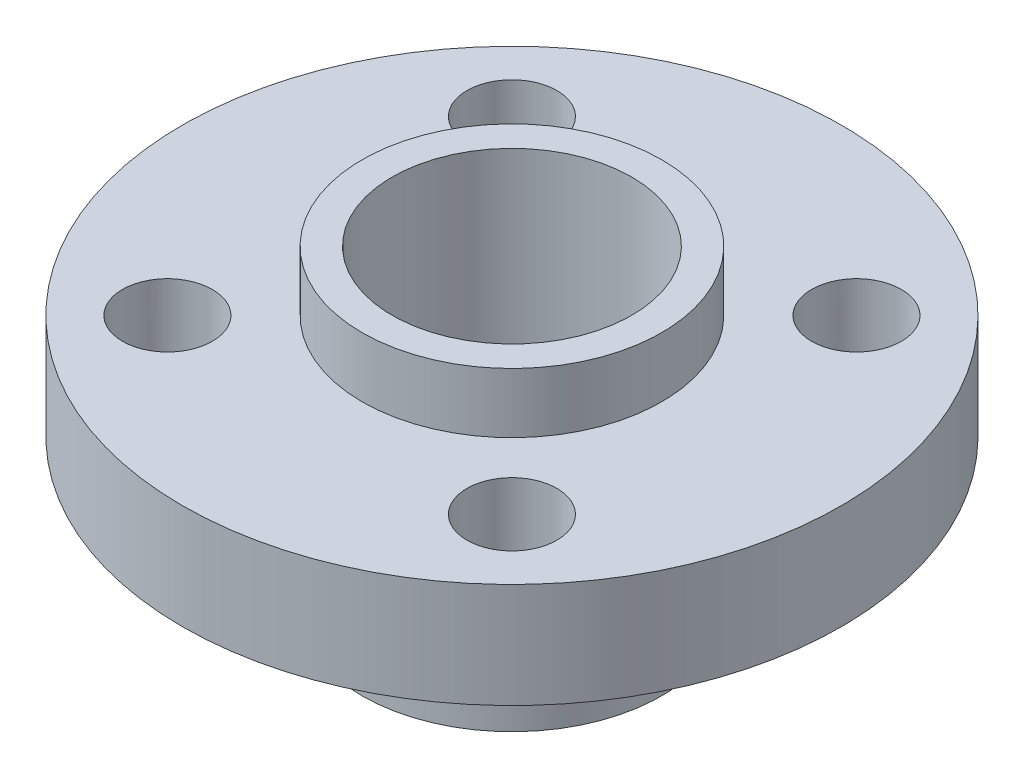
ISO-10303-21;
HEADER;
FILE_DESCRIPTION(('STEP AP214'),'2;1');
FILE_NAME('part.step','',(''),(''),'','','');
FILE_SCHEMA(('AUTOMOTIVE_DESIGN { 1 0 10303 214 1 1 1 1 }'));
ENDSEC;
DATA;
#1=APPLICATION_CONTEXT('core data for automotive mechanical design processes');
#2=APPLICATION_PROTOCOL_DEFINITION('international standard','automotive_design',2000,#1);
#3=PRODUCT_CONTEXT('',#1,'mechanical');
#4=PRODUCT('Part','Part','',(#3));
#5=PRODUCT_RELATED_PRODUCT_CATEGORY('part','',(#4));
#6=PRODUCT_DEFINITION_FORMATION('','',#4);
#7=PRODUCT_DEFINITION_CONTEXT('part definition',#1,'design');
#8=PRODUCT_DEFINITION('design','',#6,#7);
#9=PRODUCT_DEFINITION_SHAPE('','',#8);
#10=(LENGTH_UNIT() NAMED_UNIT(*) SI_UNIT(.MILLI.,.METRE.));
#11=(NAMED_UNIT(*) PLANE_ANGLE_UNIT() SI_UNIT($,.RADIAN.));
#12=(NAMED_UNIT(*) SI_UNIT($,.STERADIAN.) SOLID_ANGLE_UNIT());
#13=UNCERTAINTY_MEASURE_WITH_UNIT(LENGTH_MEASURE(1.E-05),#10,'distance_accuracy_value','');
#14=(GEOMETRIC_REPRESENTATION_CONTEXT(3) GLOBAL_UNCERTAINTY_ASSIGNED_CONTEXT((#13)) GLOBAL_UNIT_ASSIGNED_CONTEXT((#10,
#11,#12)) REPRESENTATION_CONTEXT('',''));
#15=CARTESIAN_POINT('',(0.,0.,0.));
#16=DIRECTION('',(0.,0.,1.));
#17=DIRECTION('',(1.,0.,0.));
#18=AXIS2_PLACEMENT_3D('',#15,#16,#17);
#19=CARTESIAN_POINT('',(0.,10.5,0.));
#20=DIRECTION('',(0.,-1.,0.));
#21=DIRECTION('',(0.,0.,-1.));
#22=AXIS2_PLACEMENT_3D('',#19,#20,#21);
#23=CYLINDRICAL_SURFACE('',#22,5.);
#24=CARTESIAN_POINT('',(0.,0.,0.));
#25=DIRECTION('',(0.,1.,0.));
#26=DIRECTION('',(0.,0.,1.));
#27=AXIS2_PLACEMENT_3D('',#24,#25,#26);
#28=CIRCLE('',#27,5.);
#29=CARTESIAN_POINT('',(0.,0.,-5.));
#30=VERTEX_POINT('',#29);
#31=EDGE_CURVE('E41',#30,#30,#28,.T.);
#32=CARTESIAN_POINT('',(0.,5.,0.));
#33=DIRECTION('',(0.,1.,0.));
#34=DIRECTION('',(0.,0.,1.));
#35=AXIS2_PLACEMENT_3D('',#32,#33,#34);
#36=CIRCLE('',#35,5.);
#37=CARTESIAN_POINT('',(0.,5.,-5.));
#38=VERTEX_POINT('',#37);
#39=EDGE_CURVE('E10',#38,#38,#36,.T.);
#40=CARTESIAN_POINT('',(0.,0.,-5.));
#41=CARTESIAN_POINT('',(0.,0.0520833333333334,-5.));
#42=CARTESIAN_POINT('',(0.,0.104166666666667,-5.));
#43=CARTESIAN_POINT('',(0.,0.208333333333334,-5.));
#44=CARTESIAN_POINT('',(0.,0.260416666666667,-5.));
#45=CARTESIAN_POINT('',(0.,0.364583333333334,-5.));
#46=CARTESIAN_POINT('',(0.,0.416666666666667,-5.));
#47=CARTESIAN_POINT('',(0.,0.520833333333334,-5.));
#48=CARTESIAN_POINT('',(0.,0.572916666666667,-5.));
#49=CARTESIAN_POINT('',(0.,0.677083333333334,-5.));
#50=CARTESIAN_POINT('',(0.,0.729166666666667,-5.));
#51=CARTESIAN_POINT('',(0.,0.833333333333334,-5.));
#52=CARTESIAN_POINT('',(0.,0.885416666666668,-5.));
#53=CARTESIAN_POINT('',(0.,0.989583333333334,-5.));
#54=CARTESIAN_POINT('',(0.,1.04166666666667,-5.));
#55=CARTESIAN_POINT('',(0.,1.14583333333333,-5.));
#56=CARTESIAN_POINT('',(0.,1.19791666666667,-5.));
#57=CARTESIAN_POINT('',(0.,1.30208333333333,-5.));
#58=CARTESIAN_POINT('',(0.,1.35416666666667,-5.));
#59=CARTESIAN_POINT('',(0.,1.45833333333333,-5.));
#60=CARTESIAN_POINT('',(0.,1.51041666666667,-5.));
#61=CARTESIAN_POINT('',(0.,1.61458333333333,-5.));
#62=CARTESIAN_POINT('',(0.,1.66666666666667,-5.));
#63=CARTESIAN_POINT('',(0.,1.77083333333333,-5.));
#64=CARTESIAN_POINT('',(0.,1.82291666666667,-5.));
#65=CARTESIAN_POINT('',(0.,1.92708333333333,-5.));
#66=CARTESIAN_POINT('',(0.,1.97916666666667,-5.));
#67=CARTESIAN_POINT('',(0.,2.08333333333333,-5.));
#68=CARTESIAN_POINT('',(0.,2.13541666666667,-5.));
#69=CARTESIAN_POINT('',(0.,2.23958333333333,-5.));
#70=CARTESIAN_POINT('',(0.,2.29166666666667,-5.));
#71=CARTESIAN_POINT('',(0.,2.39583333333333,-5.));
#72=CARTESIAN_POINT('',(0.,2.44791666666667,-5.));
#73=CARTESIAN_POINT('',(0.,2.55208333333333,-5.));
#74=CARTESIAN_POINT('',(0.,2.60416666666667,-5.));
#75=CARTESIAN_POINT('',(0.,2.70833333333333,-5.));
#76=CARTESIAN_POINT('',(0.,2.76041666666667,-5.));
#77=CARTESIAN_POINT('',(0.,2.86458333333333,-5.));
#78=CARTESIAN_POINT('',(0.,2.91666666666667,-5.));
#79=CARTESIAN_POINT('',(0.,3.02083333333333,-5.));
#80=CARTESIAN_POINT('',(0.,3.07291666666667,-5.));
#81=CARTESIAN_POINT('',(0.,3.17708333333333,-5.));
#82=CARTESIAN_POINT('',(0.,3.22916666666667,-5.));
#83=CARTESIAN_POINT('',(0.,3.33333333333333,-5.));
#84=CARTESIAN_POINT('',(0.,3.38541666666667,-5.));
#85=CARTESIAN_POINT('',(0.,3.48958333333333,-5.));
#86=CARTESIAN_POINT('',(0.,3.54166666666667,-5.));
#87=CARTESIAN_POINT('',(0.,3.64583333333333,-5.));
#88=CARTESIAN_POINT('',(0.,3.69791666666667,-5.));
#89=CARTESIAN_POINT('',(0.,3.80208333333333,-5.));
#90=CARTESIAN_POINT('',(0.,3.85416666666667,-5.));
#91=CARTESIAN_POINT('',(0.,3.95833333333333,-5.));
#92=CARTESIAN_POINT('',(0.,4.01041666666667,-5.));
#93=CARTESIAN_POINT('',(0.,4.11458333333333,-5.));
#94=CARTESIAN_POINT('',(0.,4.16666666666667,-5.));
#95=CARTESIAN_POINT('',(0.,4.27083333333333,-5.));
#96=CARTESIAN_POINT('',(0.,4.32291666666667,-5.));
#97=CARTESIAN_POINT('',(0.,4.42708333333333,-5.));
#98=CARTESIAN_POINT('',(0.,4.47916666666667,-5.));
#99=CARTESIAN_POINT('',(0.,4.58333333333333,-5.));
#100=CARTESIAN_POINT('',(0.,4.63541666666667,-5.));
#101=CARTESIAN_POINT('',(0.,4.73958333333333,-5.));
#102=CARTESIAN_POINT('',(0.,4.79166666666667,-5.));
#103=CARTESIAN_POINT('',(0.,4.89583333333333,-5.));
#104=CARTESIAN_POINT('',(0.,4.94791666666667,-5.));
#105=CARTESIAN_POINT('',(0.,5.,-5.));
#106=B_SPLINE_CURVE_WITH_KNOTS('',3,(#40,#41,#42,#43,#44,#45,#46,#47,#48,#49,#50,#51,#52,#53,
#54,#55,#56,#57,#58,#59,#60,#61,#62,#63,#64,#65,#66,#67,#68,#69,#70,#71,#72,#73,#74,#75,#76,#77,
#78,#79,#80,#81,#82,#83,#84,#85,#86,#87,#88,#89,#90,#91,#92,#93,#94,#95,#96,#97,#98,#99,#100,
#101,#102,#103,#104,#105),.UNSPECIFIED.,.F.,.F.,(4,2,2,2,2,2,2,2,2,2,2,2,2,2,2,2,2,2,2,2,2,2,2,
2,2,2,2,2,2,2,2,2,4),(0.,0.15625,0.3125,0.46875,0.625000000000001,0.781250000000001,
0.937500000000001,1.09375,1.25,1.40625,1.5625,1.71875,1.875,2.03125,2.1875,2.34375,2.5,2.65625,
2.8125,2.96875,3.125,3.28125,3.4375,3.59375,3.75,3.90625,4.0625,4.21875,4.375,4.53125,4.6875,
4.84375,5.),.UNSPECIFIED.);
#107=EDGE_CURVE('BSEAM30',#30,#38,#106,.T.);
#108=ORIENTED_EDGE('',*,*,#31,.T.);
#109=ORIENTED_EDGE('',*,*,#39,.F.);
#110=ORIENTED_EDGE('',*,*,#107,.T.);
#111=ORIENTED_EDGE('',*,*,#107,.F.);
#112=EDGE_LOOP('',(#108,#110,#109,#111));
#113=FACE_BOUND('',#112,.T.);
#114=ADVANCED_FACE('F30',(#113),#23,.T.);
#115=CARTESIAN_POINT('',(0.,10.5,0.));
#116=DIRECTION('',(0.,1.,0.));
#117=DIRECTION('',(0.,0.,1.));
#118=AXIS2_PLACEMENT_3D('',#115,#116,#117);
#119=PLANE('',#118);
#120=CARTESIAN_POINT('',(0.,10.5,0.));
#121=DIRECTION('',(0.,1.,0.));
#122=DIRECTION('',(0.,0.,1.));
#123=AXIS2_PLACEMENT_3D('',#120,#121,#122);
#124=CIRCLE('',#123,5.);
#125=CARTESIAN_POINT('',(0.,10.5,-5.));
#126=VERTEX_POINT('',#125);
#127=EDGE_CURVE('E37',#126,#126,#124,.T.);
#128=ORIENTED_EDGE('',*,*,#127,.T.);
#129=EDGE_LOOP('',(#128));
#130=FACE_BOUND('',#129,.T.);
#131=CARTESIAN_POINT('',(0.,10.5,0.));
#132=DIRECTION('',(0.,1.,0.));
#133=DIRECTION('',(0.,0.,1.));
#134=AXIS2_PLACEMENT_3D('',#131,#132,#133);
#135=CIRCLE('',#134,4.);
#136=CARTESIAN_POINT('',(0.,10.5,-4.));
#137=VERTEX_POINT('',#136);
#138=EDGE_CURVE('E46',#137,#137,#135,.T.);
#139=ORIENTED_EDGE('',*,*,#138,.F.);
#140=EDGE_LOOP('',(#139));
#141=FACE_BOUND('',#140,.T.);
#142=ADVANCED_FACE('F73',(#130,#141),#119,.T.);
#143=CARTESIAN_POINT('',(0.,0.,0.));
#144=DIRECTION('',(0.,1.,0.));
#145=DIRECTION('',(0.,0.,1.));
#146=AXIS2_PLACEMENT_3D('',#143,#144,#145);
#147=PLANE('',#146);
#148=ORIENTED_EDGE('',*,*,#31,.F.);
#149=EDGE_LOOP('',(#148));
#150=FACE_BOUND('',#149,.T.);
#151=CARTESIAN_POINT('',(0.,0.,0.));
#152=DIRECTION('',(0.,1.,0.));
#153=DIRECTION('',(0.,0.,1.));
#154=AXIS2_PLACEMENT_3D('',#151,#152,#153);
#155=CIRCLE('',#154,4.);
#156=CARTESIAN_POINT('',(0.,0.,-4.));
#157=VERTEX_POINT('',#156);
#158=EDGE_CURVE('E49',#157,#157,#155,.T.);
#159=ORIENTED_EDGE('',*,*,#158,.T.);
#160=EDGE_LOOP('',(#159));
#161=FACE_BOUND('',#160,.T.);
#162=ADVANCED_FACE('F75',(#150,#161),#147,.F.);
#163=CARTESIAN_POINT('',(0.,8.5,0.));
#164=DIRECTION('',(0.,1.,0.));
#165=DIRECTION('',(0.,0.,1.));
#166=AXIS2_PLACEMENT_3D('',#163,#164,#165);
#167=CIRCLE('',#166,5.);
#168=CARTESIAN_POINT('',(0.,8.5,-5.));
#169=VERTEX_POINT('',#168);
#170=EDGE_CURVE('E51',#169,#169,#167,.T.);
#171=CARTESIAN_POINT('',(0.,8.5,-5.));
#172=CARTESIAN_POINT('',(0.,8.52083333333333,-5.));
#173=CARTESIAN_POINT('',(0.,8.54166666666667,-5.));
#174=CARTESIAN_POINT('',(0.,8.58333333333333,-5.));
#175=CARTESIAN_POINT('',(0.,8.60416666666667,-5.));
#176=CARTESIAN_POINT('',(0.,8.64583333333333,-5.));
#177=CARTESIAN_POINT('',(0.,8.66666666666667,-5.));
#178=CARTESIAN_POINT('',(0.,8.70833333333333,-5.));
#179=CARTESIAN_POINT('',(0.,8.72916666666667,-5.));
#180=CARTESIAN_POINT('',(0.,8.77083333333333,-5.));
#181=CARTESIAN_POINT('',(0.,8.79166666666667,-5.));
#182=CARTESIAN_POINT('',(0.,8.83333333333333,-5.));
#183=CARTESIAN_POINT('',(0.,8.85416666666667,-5.));
#184=CARTESIAN_POINT('',(0.,8.89583333333333,-5.));
#185=CARTESIAN_POINT('',(0.,8.91666666666667,-5.));
#186=CARTESIAN_POINT('',(0.,8.95833333333333,-5.));
#187=CARTESIAN_POINT('',(0.,8.97916666666667,-5.));
#188=CARTESIAN_POINT('',(0.,9.02083333333333,-5.));
#189=CARTESIAN_POINT('',(0.,9.04166666666667,-5.));
#190=CARTESIAN_POINT('',(0.,9.08333333333333,-5.));
#191=CARTESIAN_POINT('',(0.,9.10416666666667,-5.));
#192=CARTESIAN_POINT('',(0.,9.14583333333333,-5.));
#193=CARTESIAN_POINT('',(0.,9.16666666666667,-5.));
#194=CARTESIAN_POINT('',(0.,9.20833333333333,-5.));
#195=CARTESIAN_POINT('',(0.,9.22916666666667,-5.));
#196=CARTESIAN_POINT('',(0.,9.27083333333333,-5.));
#197=CARTESIAN_POINT('',(0.,9.29166666666667,-5.));
#198=CARTESIAN_POINT('',(0.,9.33333333333333,-5.));
#199=CARTESIAN_POINT('',(0.,9.35416666666667,-5.));
#200=CARTESIAN_POINT('',(0.,9.39583333333333,-5.));
#201=CARTESIAN_POINT('',(0.,9.41666666666667,-5.));
#202=CARTESIAN_POINT('',(0.,9.45833333333333,-5.));
#203=CARTESIAN_POINT('',(0.,9.47916666666667,-5.));
#204=CARTESIAN_POINT('',(0.,9.52083333333333,-5.));
#205=CARTESIAN_POINT('',(0.,9.54166666666667,-5.));
#206=CARTESIAN_POINT('',(0.,9.58333333333333,-5.));
#207=CARTESIAN_POINT('',(0.,9.60416666666667,-5.));
#208=CARTESIAN_POINT('',(0.,9.64583333333333,-5.));
#209=CARTESIAN_POINT('',(0.,9.66666666666667,-5.));
#210=CARTESIAN_POINT('',(0.,9.70833333333333,-5.));
#211=CARTESIAN_POINT('',(0.,9.72916666666667,-5.));
#212=CARTESIAN_POINT('',(0.,9.77083333333333,-5.));
#213=CARTESIAN_POINT('',(0.,9.79166666666667,-5.));
#214=CARTESIAN_POINT('',(0.,9.83333333333333,-5.));
#215=CARTESIAN_POINT('',(0.,9.85416666666667,-5.));
#216=CARTESIAN_POINT('',(0.,9.89583333333333,-5.));
#217=CARTESIAN_POINT('',(0.,9.91666666666667,-5.));
#218=CARTESIAN_POINT('',(0.,9.95833333333333,-5.));
#219=CARTESIAN_POINT('',(0.,9.97916666666667,-5.));
#220=CARTESIAN_POINT('',(0.,10.0208333333333,-5.));
#221=CARTESIAN_POINT('',(0.,10.0416666666667,-5.));
#222=CARTESIAN_POINT('',(0.,10.0833333333333,-5.));
#223=CARTESIAN_POINT('',(0.,10.1041666666667,-5.));
#224=CARTESIAN_POINT('',(0.,10.1458333333333,-5.));
#225=CARTESIAN_POINT('',(0.,10.1666666666667,-5.));
#226=CARTESIAN_POINT('',(0.,10.2083333333333,-5.));
#227=CARTESIAN_POINT('',(0.,10.2291666666667,-5.));
#228=CARTESIAN_POINT('',(0.,10.2708333333333,-5.));
#229=CARTESIAN_POINT('',(0.,10.2916666666667,-5.));
#230=CARTESIAN_POINT('',(0.,10.3333333333333,-5.));
#231=CARTESIAN_POINT('',(0.,10.3541666666667,-5.));
#232=CARTESIAN_POINT('',(0.,10.3958333333333,-5.));
#233=CARTESIAN_POINT('',(0.,10.4166666666667,-5.));
#234=CARTESIAN_POINT('',(0.,10.4583333333333,-5.));
#235=CARTESIAN_POINT('',(0.,10.4791666666667,-5.));
#236=CARTESIAN_POINT('',(0.,10.5,-5.));
#237=B_SPLINE_CURVE_WITH_KNOTS('',3,(#171,#172,#173,#174,#175,#176,#177,#178,#179,#180,#181,
#182,#183,#184,#185,#186,#187,#188,#189,#190,#191,#192,#193,#194,#195,#196,#197,#198,#199,#200,
#201,#202,#203,#204,#205,#206,#207,#208,#209,#210,#211,#212,#213,#214,#215,#216,#217,#218,#219,
#220,#221,#222,#223,#224,#225,#226,#227,#228,#229,#230,#231,#232,#233,#234,#235,#236),
.UNSPECIFIED.,.F.,.F.,(4,2,2,2,2,2,2,2,2,2,2,2,2,2,2,2,2,2,2,2,2,2,2,2,2,2,2,2,2,2,2,2,4),(0.,
0.0625000000000001,0.125,0.1875,0.25,0.3125,0.375,0.4375,0.5,0.5625,0.625000000000001,
0.687500000000001,0.750000000000001,0.812500000000001,0.875000000000001,0.937500000000001,1.,
1.0625,1.125,1.1875,1.25,1.3125,1.375,1.4375,1.5,1.5625,1.625,1.6875,1.75,1.8125,1.875,1.9375,
2.),.UNSPECIFIED.);
#238=EDGE_CURVE('BSEAM32',#169,#126,#237,.T.);
#239=ORIENTED_EDGE('',*,*,#170,.T.);
#240=ORIENTED_EDGE('',*,*,#127,.F.);
#241=ORIENTED_EDGE('',*,*,#238,.T.);
#242=ORIENTED_EDGE('',*,*,#238,.F.);
#243=EDGE_LOOP('',(#239,#241,#240,#242));
#244=FACE_BOUND('',#243,.T.);
#245=ADVANCED_FACE('F32',(#244),#23,.T.);
#246=CARTESIAN_POINT('',(0.,10.5,0.));
#247=DIRECTION('',(0.,-1.,0.));
#248=DIRECTION('',(0.,0.,-1.));
#249=AXIS2_PLACEMENT_3D('',#246,#247,#248);
#250=CYLINDRICAL_SURFACE('',#249,4.);
#251=CARTESIAN_POINT('',(0.,10.5,-4.));
#252=CARTESIAN_POINT('',(0.,10.390625,-4.));
#253=CARTESIAN_POINT('',(0.,10.28125,-4.));
#254=CARTESIAN_POINT('',(0.,10.0625,-4.));
#255=CARTESIAN_POINT('',(0.,9.953125,-4.));
#256=CARTESIAN_POINT('',(0.,9.734375,-4.));
#257=CARTESIAN_POINT('',(0.,9.625,-4.));
#258=CARTESIAN_POINT('',(0.,9.40625,-4.));
#259=CARTESIAN_POINT('',(0.,9.296875,-4.));
#260=CARTESIAN_POINT('',(0.,9.078125,-4.));
#261=CARTESIAN_POINT('',(0.,8.96875,-4.));
#262=CARTESIAN_POINT('',(0.,8.75,-4.));
#263=CARTESIAN_POINT('',(0.,8.640625,-4.));
#264=CARTESIAN_POINT('',(0.,8.421875,-4.));
#265=CARTESIAN_POINT('',(0.,8.3125,-4.));
#266=CARTESIAN_POINT('',(0.,8.09375,-4.));
#267=CARTESIAN_POINT('',(0.,7.984375,-4.));
#268=CARTESIAN_POINT('',(0.,7.765625,-4.));
#269=CARTESIAN_POINT('',(0.,7.65625,-4.));
#270=CARTESIAN_POINT('',(0.,7.4375,-4.));
#271=CARTESIAN_POINT('',(0.,7.328125,-4.));
#272=CARTESIAN_POINT('',(0.,7.109375,-4.));
#273=CARTESIAN_POINT('',(0.,7.,-4.));
#274=CARTESIAN_POINT('',(0.,6.78125,-4.));
#275=CARTESIAN_POINT('',(0.,6.671875,-4.));
#276=CARTESIAN_POINT('',(0.,6.453125,-4.));
#277=CARTESIAN_POINT('',(0.,6.34375,-4.));
#278=CARTESIAN_POINT('',(0.,6.125,-4.));
#279=CARTESIAN_POINT('',(0.,6.015625,-4.));
#280=CARTESIAN_POINT('',(0.,5.796875,-4.));
#281=CARTESIAN_POINT('',(0.,5.6875,-4.));
#282=CARTESIAN_POINT('',(0.,5.46875,-4.));
#283=CARTESIAN_POINT('',(0.,5.359375,-4.));
#284=CARTESIAN_POINT('',(0.,5.140625,-4.));
#285=CARTESIAN_POINT('',(0.,5.03125,-4.));
#286=CARTESIAN_POINT('',(0.,4.8125,-4.));
#287=CARTESIAN_POINT('',(0.,4.703125,-4.));
#288=CARTESIAN_POINT('',(0.,4.484375,-4.));
#289=CARTESIAN_POINT('',(0.,4.375,-4.));
#290=CARTESIAN_POINT('',(0.,4.15625,-4.));
#291=CARTESIAN_POINT('',(0.,4.046875,-4.));
#292=CARTESIAN_POINT('',(0.,3.828125,-4.));
#293=CARTESIAN_POINT('',(0.,3.71875,-4.));
#294=CARTESIAN_POINT('',(0.,3.5,-4.));
#295=CARTESIAN_POINT('',(0.,3.390625,-4.));
#296=CARTESIAN_POINT('',(0.,3.171875,-4.));
#297=CARTESIAN_POINT('',(0.,3.0625,-4.));
#298=CARTESIAN_POINT('',(0.,2.84375,-4.));
#299=CARTESIAN_POINT('',(0.,2.734375,-4.));
#300=CARTESIAN_POINT('',(0.,2.515625,-4.));
#301=CARTESIAN_POINT('',(0.,2.40625,-4.));
#302=CARTESIAN_POINT('',(0.,2.1875,-4.));
#303=CARTESIAN_POINT('',(0.,2.078125,-4.));
#304=CARTESIAN_POINT('',(0.,1.859375,-4.));
#305=CARTESIAN_POINT('',(0.,1.75,-4.));
#306=CARTESIAN_POINT('',(0.,1.53125,-4.));
#307=CARTESIAN_POINT('',(0.,1.421875,-4.));
#308=CARTESIAN_POINT('',(0.,1.203125,-4.));
#309=CARTESIAN_POINT('',(0.,1.09375,-4.));
#310=CARTESIAN_POINT('',(0.,0.875000000000001,-4.));
#311=CARTESIAN_POINT('',(0.,0.765625000000001,-4.));
#312=CARTESIAN_POINT('',(0.,0.546875,-4.));
#313=CARTESIAN_POINT('',(0.,0.4375,-4.));
#314=CARTESIAN_POINT('',(0.,0.21875,-4.));
#315=CARTESIAN_POINT('',(0.,0.109375,-4.));
#316=CARTESIAN_POINT('',(0.,0.,-4.));
#317=B_SPLINE_CURVE_WITH_KNOTS('',3,(#251,#252,#253,#254,#255,#256,#257,#258,#259,#260,#261,
#262,#263,#264,#265,#266,#267,#268,#269,#270,#271,#272,#273,#274,#275,#276,#277,#278,#279,#280,
#281,#282,#283,#284,#285,#286,#287,#288,#289,#290,#291,#292,#293,#294,#295,#296,#297,#298,#299,
#300,#301,#302,#303,#304,#305,#306,#307,#308,#309,#310,#311,#312,#313,#314,#315,#316),
.UNSPECIFIED.,.F.,.F.,(4,2,2,2,2,2,2,2,2,2,2,2,2,2,2,2,2,2,2,2,2,2,2,2,2,2,2,2,2,2,2,2,4),(0.,
0.328124999999999,0.656249999999999,0.984374999999999,1.3125,1.640625,1.96875,2.296875,2.625,
2.953125,3.28125,3.609375,3.9375,4.265625,4.59375,4.921875,5.25,5.578125,5.90625,6.234375,
6.5625,6.890625,7.21875,7.546875,7.875,8.203125,8.53125,8.859375,9.1875,9.515625,9.84375,
10.171875,10.5),.UNSPECIFIED.);
#318=EDGE_CURVE('BSEAM70',#137,#157,#317,.T.);
#319=ORIENTED_EDGE('',*,*,#138,.T.);
#320=ORIENTED_EDGE('',*,*,#158,.F.);
#321=ORIENTED_EDGE('',*,*,#318,.T.);
#322=ORIENTED_EDGE('',*,*,#318,.F.);
#323=EDGE_LOOP('',(#319,#321,#320,#322));
#324=FACE_BOUND('',#323,.T.);
#325=ADVANCED_FACE('F70',(#324),#250,.F.);
#326=CARTESIAN_POINT('',(0.,5.,0.));
#327=DIRECTION('',(0.,1.,0.));
#328=DIRECTION('',(0.,0.,1.));
#329=AXIS2_PLACEMENT_3D('',#326,#327,#328);
#330=PLANE('',#329);
#331=CARTESIAN_POINT('',(-5.75,5.,5.74999999999994));
#332=DIRECTION('',(0.,1.,0.));
#333=DIRECTION('',(0.,0.,1.));
#334=AXIS2_PLACEMENT_3D('',#331,#332,#333);
#335=CIRCLE('',#334,1.5);
#336=CARTESIAN_POINT('',(-5.75,5.,7.24999999999994));
#337=VERTEX_POINT('',#336);
#338=EDGE_CURVE('E120',#337,#337,#335,.T.);
#339=ORIENTED_EDGE('',*,*,#338,.T.);
#340=EDGE_LOOP('',(#339));
#341=FACE_BOUND('',#340,.T.);
#342=CARTESIAN_POINT('',(5.75,5.,5.74999999999994));
#343=DIRECTION('',(0.,1.,0.));
#344=DIRECTION('',(0.,0.,1.));
#345=AXIS2_PLACEMENT_3D('',#342,#343,#344);
#346=CIRCLE('',#345,1.5);
#347=CARTESIAN_POINT('',(5.75,5.,7.24999999999994));
#348=VERTEX_POINT('',#347);
#349=EDGE_CURVE('E124',#348,#348,#346,.T.);
#350=ORIENTED_EDGE('',*,*,#349,.T.);
#351=EDGE_LOOP('',(#350));
#352=FACE_BOUND('',#351,.T.);
#353=CARTESIAN_POINT('',(5.75,5.,-5.74999999999994));
#354=DIRECTION('',(0.,1.,0.));
#355=DIRECTION('',(0.,0.,1.));
#356=AXIS2_PLACEMENT_3D('',#353,#354,#355);
#357=CIRCLE('',#356,1.5);
#358=CARTESIAN_POINT('',(5.75,5.,-4.24999999999994));
#359=VERTEX_POINT('',#358);
#360=EDGE_CURVE('E133',#359,#359,#357,.T.);
#361=ORIENTED_EDGE('',*,*,#360,.T.);
#362=EDGE_LOOP('',(#361));
#363=FACE_BOUND('',#362,.T.);
#364=CARTESIAN_POINT('',(-5.75,5.,-5.74999999999994));
#365=DIRECTION('',(0.,1.,0.));
#366=DIRECTION('',(0.,0.,1.));
#367=AXIS2_PLACEMENT_3D('',#364,#365,#366);
#368=CIRCLE('',#367,1.5);
#369=CARTESIAN_POINT('',(-5.75,5.,-4.24999999999994));
#370=VERTEX_POINT('',#369);
#371=EDGE_CURVE('E63',#370,#370,#368,.T.);
#372=ORIENTED_EDGE('',*,*,#371,.T.);
#373=EDGE_LOOP('',(#372));
#374=FACE_BOUND('',#373,.T.);
#375=CARTESIAN_POINT('',(0.,5.,0.));
#376=DIRECTION('',(0.,1.,0.));
#377=DIRECTION('',(0.,0.,1.));
#378=AXIS2_PLACEMENT_3D('',#375,#376,#377);
#379=CIRCLE('',#378,11.);
#380=CARTESIAN_POINT('',(0.,5.,11.));
#381=VERTEX_POINT('',#380);
#382=EDGE_CURVE('E53',#381,#381,#379,.T.);
#383=ORIENTED_EDGE('',*,*,#382,.F.);
#384=EDGE_LOOP('',(#383));
#385=FACE_BOUND('',#384,.T.);
#386=ORIENTED_EDGE('',*,*,#39,.T.);
#387=EDGE_LOOP('',(#386));
#388=FACE_BOUND('',#387,.T.);
#389=ADVANCED_FACE('F86',(#341,#352,#363,#374,#385,#388),#330,.F.);
#390=CARTESIAN_POINT('',(0.,8.5,0.));
#391=DIRECTION('',(0.,1.,0.));
#392=DIRECTION('',(0.,0.,1.));
#393=AXIS2_PLACEMENT_3D('',#390,#391,#392);
#394=PLANE('',#393);
#395=CARTESIAN_POINT('',(-5.75,8.5,5.74999999999994));
#396=DIRECTION('',(0.,1.,0.));
#397=DIRECTION('',(0.,0.,-1.));
#398=AXIS2_PLACEMENT_3D('',#395,#396,#397);
#399=CIRCLE('',#398,1.5);
#400=CARTESIAN_POINT('',(-5.75,8.5,4.24999999999994));
#401=VERTEX_POINT('',#400);
#402=EDGE_CURVE('E117',#401,#401,#399,.T.);
#403=ORIENTED_EDGE('',*,*,#402,.F.);
#404=EDGE_LOOP('',(#403));
#405=FACE_BOUND('',#404,.T.);
#406=CARTESIAN_POINT('',(5.75,8.5,5.74999999999994));
#407=DIRECTION('',(0.,1.,0.));
#408=DIRECTION('',(0.,0.,1.));
#409=AXIS2_PLACEMENT_3D('',#406,#407,#408);
#410=CIRCLE('',#409,1.5);
#411=CARTESIAN_POINT('',(5.75,8.5,7.24999999999994));
#412=VERTEX_POINT('',#411);
#413=EDGE_CURVE('E121',#412,#412,#410,.T.);
#414=ORIENTED_EDGE('',*,*,#413,.F.);
#415=EDGE_LOOP('',(#414));
#416=FACE_BOUND('',#415,.T.);
#417=CARTESIAN_POINT('',(5.75,8.5,-5.74999999999994));
#418=DIRECTION('',(0.,1.,0.));
#419=DIRECTION('',(0.,0.,-1.));
#420=AXIS2_PLACEMENT_3D('',#417,#418,#419);
#421=CIRCLE('',#420,1.5);
#422=CARTESIAN_POINT('',(5.75,8.5,-7.24999999999994));
#423=VERTEX_POINT('',#422);
#424=EDGE_CURVE('E130',#423,#423,#421,.T.);
#425=ORIENTED_EDGE('',*,*,#424,.F.);
#426=EDGE_LOOP('',(#425));
#427=FACE_BOUND('',#426,.T.);
#428=CARTESIAN_POINT('',(-5.75,8.5,-5.74999999999994));
#429=DIRECTION('',(0.,1.,0.));
#430=DIRECTION('',(0.,0.,1.));
#431=AXIS2_PLACEMENT_3D('',#428,#429,#430);
#432=CIRCLE('',#431,1.5);
#433=CARTESIAN_POINT('',(-5.75,8.5,-4.24999999999994));
#434=VERTEX_POINT('',#433);
#435=EDGE_CURVE('E135',#434,#434,#432,.T.);
#436=ORIENTED_EDGE('',*,*,#435,.F.);
#437=EDGE_LOOP('',(#436));
#438=FACE_BOUND('',#437,.T.);
#439=CARTESIAN_POINT('',(0.,8.5,0.));
#440=DIRECTION('',(0.,1.,0.));
#441=DIRECTION('',(0.,0.,1.));
#442=AXIS2_PLACEMENT_3D('',#439,#440,#441);
#443=CIRCLE('',#442,11.);
#444=CARTESIAN_POINT('',(0.,8.5,11.));
#445=VERTEX_POINT('',#444);
#446=EDGE_CURVE('E58',#445,#445,#443,.T.);
#447=ORIENTED_EDGE('',*,*,#446,.T.);
#448=EDGE_LOOP('',(#447));
#449=FACE_BOUND('',#448,.T.);
#450=ORIENTED_EDGE('',*,*,#170,.F.);
#451=EDGE_LOOP('',(#450));
#452=FACE_BOUND('',#451,.T.);
#453=ADVANCED_FACE('F91',(#405,#416,#427,#438,#449,#452),#394,.T.);
#454=CARTESIAN_POINT('',(0.,5.,0.));
#455=DIRECTION('',(0.,1.,0.));
#456=DIRECTION('',(0.,0.,1.));
#457=AXIS2_PLACEMENT_3D('',#454,#455,#456);
#458=CYLINDRICAL_SURFACE('',#457,11.);
#459=ORIENTED_EDGE('',*,*,#382,.T.);
#460=EDGE_LOOP('',(#459));
#461=FACE_BOUND('',#460,.T.);
#462=ORIENTED_EDGE('',*,*,#446,.F.);
#463=EDGE_LOOP('',(#462));
#464=FACE_BOUND('',#463,.T.);
#465=ADVANCED_FACE('F87',(#461,#464),#458,.T.);
#466=CARTESIAN_POINT('',(-5.75,0.,-5.74999999999994));
#467=DIRECTION('',(0.,1.,0.));
#468=DIRECTION('',(0.,0.,1.));
#469=AXIS2_PLACEMENT_3D('',#466,#467,#468);
#470=CYLINDRICAL_SURFACE('',#469,1.5);
#471=ORIENTED_EDGE('',*,*,#435,.T.);
#472=EDGE_LOOP('',(#471));
#473=FACE_BOUND('',#472,.T.);
#474=ORIENTED_EDGE('',*,*,#371,.F.);
#475=EDGE_LOOP('',(#474));
#476=FACE_BOUND('',#475,.T.);
#477=ADVANCED_FACE('F90',(#473,#476),#470,.F.);
#478=CARTESIAN_POINT('',(5.75,0.,-5.74999999999994));
#479=DIRECTION('',(0.,1.,0.));
#480=DIRECTION('',(0.,0.,1.));
#481=AXIS2_PLACEMENT_3D('',#478,#479,#480);
#482=CYLINDRICAL_SURFACE('',#481,1.5);
#483=ORIENTED_EDGE('',*,*,#424,.T.);
#484=EDGE_LOOP('',(#483));
#485=FACE_BOUND('',#484,.T.);
#486=ORIENTED_EDGE('',*,*,#360,.F.);
#487=EDGE_LOOP('',(#486));
#488=FACE_BOUND('',#487,.T.);
#489=ADVANCED_FACE('F100',(#485,#488),#482,.F.);
#490=CARTESIAN_POINT('',(5.75,0.,5.74999999999994));
#491=DIRECTION('',(0.,1.,0.));
#492=DIRECTION('',(0.,0.,1.));
#493=AXIS2_PLACEMENT_3D('',#490,#491,#492);
#494=CYLINDRICAL_SURFACE('',#493,1.5);
#495=ORIENTED_EDGE('',*,*,#413,.T.);
#496=EDGE_LOOP('',(#495));
#497=FACE_BOUND('',#496,.T.);
#498=ORIENTED_EDGE('',*,*,#349,.F.);
#499=EDGE_LOOP('',(#498));
#500=FACE_BOUND('',#499,.T.);
#501=ADVANCED_FACE('F104',(#497,#500),#494,.F.);
#502=CARTESIAN_POINT('',(-5.75,0.,5.74999999999994));
#503=DIRECTION('',(0.,1.,0.));
#504=DIRECTION('',(0.,0.,1.));
#505=AXIS2_PLACEMENT_3D('',#502,#503,#504);
#506=CYLINDRICAL_SURFACE('',#505,1.5);
#507=ORIENTED_EDGE('',*,*,#402,.T.);
#508=EDGE_LOOP('',(#507));
#509=FACE_BOUND('',#508,.T.);
#510=ORIENTED_EDGE('',*,*,#338,.F.);
#511=EDGE_LOOP('',(#510));
#512=FACE_BOUND('',#511,.T.);
#513=ADVANCED_FACE('F108',(#509,#512),#506,.F.);
#514=CLOSED_SHELL('',(#114,#142,#162,#245,#325,#389,#453,#465,#477,#489,#501,#513));
#515=MANIFOLD_SOLID_BREP('B2',#514);
#516=ADVANCED_BREP_SHAPE_REPRESENTATION('',(#18,#515),#14);
#517=SHAPE_DEFINITION_REPRESENTATION(#9,#516);
ENDSEC;
END-ISO-10303-21;
